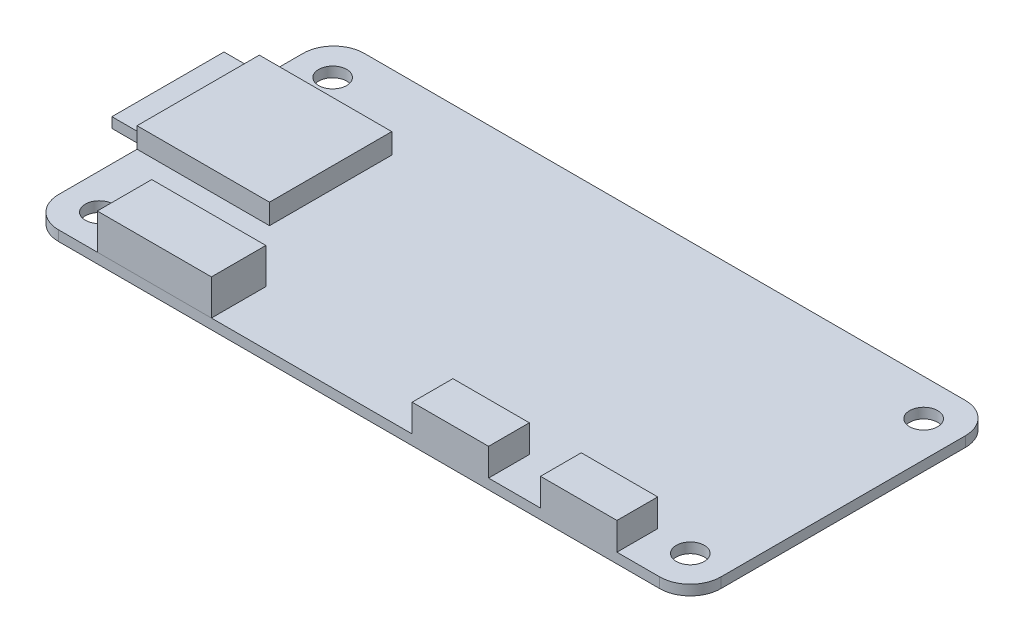
ISO-10303-21;
HEADER;
FILE_DESCRIPTION(('STEP AP214'),'2;1');
FILE_NAME('part.step','',(''),(''),'','','');
FILE_SCHEMA(('AUTOMOTIVE_DESIGN { 1 0 10303 214 1 1 1 1 }'));
ENDSEC;
DATA;
#1=APPLICATION_CONTEXT('core data for automotive mechanical design processes');
#2=APPLICATION_PROTOCOL_DEFINITION('international standard','automotive_design',2000,#1);
#3=PRODUCT_CONTEXT('',#1,'mechanical');
#4=PRODUCT('Part','Part','',(#3));
#5=PRODUCT_RELATED_PRODUCT_CATEGORY('part','',(#4));
#6=PRODUCT_DEFINITION_FORMATION('','',#4);
#7=PRODUCT_DEFINITION_CONTEXT('part definition',#1,'design');
#8=PRODUCT_DEFINITION('design','',#6,#7);
#9=PRODUCT_DEFINITION_SHAPE('','',#8);
#10=(LENGTH_UNIT() NAMED_UNIT(*) SI_UNIT(.MILLI.,.METRE.));
#11=(NAMED_UNIT(*) PLANE_ANGLE_UNIT() SI_UNIT($,.RADIAN.));
#12=(NAMED_UNIT(*) SI_UNIT($,.STERADIAN.) SOLID_ANGLE_UNIT());
#13=UNCERTAINTY_MEASURE_WITH_UNIT(LENGTH_MEASURE(1.E-05),#10,'distance_accuracy_value','');
#14=(GEOMETRIC_REPRESENTATION_CONTEXT(3) GLOBAL_UNCERTAINTY_ASSIGNED_CONTEXT((#13)) GLOBAL_UNIT_ASSIGNED_CONTEXT((#10,
#11,#12)) REPRESENTATION_CONTEXT('',''));
#15=CARTESIAN_POINT('',(0.,0.,0.));
#16=DIRECTION('',(0.,0.,1.));
#17=DIRECTION('',(1.,0.,0.));
#18=AXIS2_PLACEMENT_3D('',#15,#16,#17);
#19=CARTESIAN_POINT('',(-32.5,3.,-7.7));
#20=DIRECTION('',(1.,0.,0.));
#21=DIRECTION('',(0.,0.,-1.));
#22=AXIS2_PLACEMENT_3D('',#19,#20,#21);
#23=PLANE('',#22);
#24=DIRECTION('',(0.,-1.,0.));
#25=VECTOR('',#24,1.);
#26=CARTESIAN_POINT('',(-32.5,3.,-7.23286961546787));
#27=LINE('',#26,#25);
#28=CARTESIAN_POINT('',(-32.5,2.,-7.23286961546788));
#29=VERTEX_POINT('',#28);
#30=CARTESIAN_POINT('',(-32.5,1.,-7.23286961546788));
#31=VERTEX_POINT('',#30);
#32=EDGE_CURVE('E64',#29,#31,#27,.T.);
#33=ORIENTED_EDGE('',*,*,#32,.F.);
#34=DIRECTION('',(0.,0.,1.));
#35=VECTOR('',#34,1.);
#36=CARTESIAN_POINT('',(-32.5,2.,-7.7));
#37=LINE('',#36,#35);
#38=CARTESIAN_POINT('',(-32.5,2.,3.76713038453212));
#39=VERTEX_POINT('',#38);
#40=EDGE_CURVE('E59',#29,#39,#37,.T.);
#41=ORIENTED_EDGE('',*,*,#40,.T.);
#42=DIRECTION('',(0.,1.,0.));
#43=VECTOR('',#42,1.);
#44=CARTESIAN_POINT('',(-32.5,3.,3.76713038453212));
#45=LINE('',#44,#43);
#46=CARTESIAN_POINT('',(-32.5,1.,3.76713038453212));
#47=VERTEX_POINT('',#46);
#48=EDGE_CURVE('E124',#47,#39,#45,.T.);
#49=ORIENTED_EDGE('',*,*,#48,.F.);
#50=DIRECTION('',(0.,0.,1.));
#51=VECTOR('',#50,1.);
#52=CARTESIAN_POINT('',(-32.5,1.,-7.7));
#53=LINE('',#52,#51);
#54=CARTESIAN_POINT('',(-32.5,1.,4.29999999999999));
#55=VERTEX_POINT('',#54);
#56=EDGE_CURVE('E143',#47,#55,#53,.T.);
#57=ORIENTED_EDGE('',*,*,#56,.T.);
#58=DIRECTION('',(0.,-1.,0.));
#59=VECTOR('',#58,1.);
#60=CARTESIAN_POINT('',(-32.5,3.,4.29999999999999));
#61=LINE('',#60,#59);
#62=CARTESIAN_POINT('',(-32.5,3.,4.29999999999999));
#63=VERTEX_POINT('',#62);
#64=EDGE_CURVE('E12',#63,#55,#61,.T.);
#65=ORIENTED_EDGE('',*,*,#64,.F.);
#66=DIRECTION('',(0.,0.,1.));
#67=VECTOR('',#66,1.);
#68=CARTESIAN_POINT('',(-32.5,3.,-7.7));
#69=LINE('',#68,#67);
#70=CARTESIAN_POINT('',(-32.5,3.,-7.7));
#71=VERTEX_POINT('',#70);
#72=EDGE_CURVE('E144',#71,#63,#69,.T.);
#73=ORIENTED_EDGE('',*,*,#72,.F.);
#74=DIRECTION('',(0.,-1.,0.));
#75=VECTOR('',#74,1.);
#76=CARTESIAN_POINT('',(-32.5,3.,-7.7));
#77=LINE('',#76,#75);
#78=CARTESIAN_POINT('',(-32.5,1.,-7.7));
#79=VERTEX_POINT('',#78);
#80=EDGE_CURVE('E154',#71,#79,#77,.T.);
#81=ORIENTED_EDGE('',*,*,#80,.T.);
#82=EDGE_CURVE('E155',#79,#31,#53,.T.);
#83=ORIENTED_EDGE('',*,*,#82,.T.);
#84=EDGE_LOOP('',(#33,#41,#49,#57,#65,#73,#81,#83));
#85=FACE_BOUND('',#84,.T.);
#86=ADVANCED_FACE('F45',(#85),#23,.F.);
#87=CARTESIAN_POINT('',(-32.5,3.,4.29999999999999));
#88=DIRECTION('',(0.,0.,-1.));
#89=DIRECTION('',(-1.,0.,0.));
#90=AXIS2_PLACEMENT_3D('',#87,#88,#89);
#91=PLANE('',#90);
#92=DIRECTION('',(1.,0.,0.));
#93=VECTOR('',#92,1.);
#94=CARTESIAN_POINT('',(-32.5,1.,4.29999999999999));
#95=LINE('',#94,#93);
#96=CARTESIAN_POINT('',(-19.5,1.,4.3));
#97=VERTEX_POINT('',#96);
#98=EDGE_CURVE('E157',#55,#97,#95,.T.);
#99=ORIENTED_EDGE('',*,*,#98,.T.);
#100=DIRECTION('',(0.,-1.,0.));
#101=VECTOR('',#100,1.);
#102=CARTESIAN_POINT('',(-19.5,3.,4.3));
#103=LINE('',#102,#101);
#104=CARTESIAN_POINT('',(-19.5,3.,4.3));
#105=VERTEX_POINT('',#104);
#106=EDGE_CURVE('E52',#105,#97,#103,.T.);
#107=ORIENTED_EDGE('',*,*,#106,.F.);
#108=DIRECTION('',(1.,0.,0.));
#109=VECTOR('',#108,1.);
#110=CARTESIAN_POINT('',(-32.5,3.,4.29999999999999));
#111=LINE('',#110,#109);
#112=EDGE_CURVE('E147',#63,#105,#111,.T.);
#113=ORIENTED_EDGE('',*,*,#112,.F.);
#114=ORIENTED_EDGE('',*,*,#64,.T.);
#115=EDGE_LOOP('',(#99,#107,#113,#114));
#116=FACE_BOUND('',#115,.T.);
#117=ADVANCED_FACE('F187',(#116),#91,.F.);
#118=CARTESIAN_POINT('',(-19.5,3.,4.3));
#119=DIRECTION('',(-1.,0.,0.));
#120=DIRECTION('',(0.,0.,1.));
#121=AXIS2_PLACEMENT_3D('',#118,#119,#120);
#122=PLANE('',#121);
#123=DIRECTION('',(0.,0.,-1.));
#124=VECTOR('',#123,1.);
#125=CARTESIAN_POINT('',(-19.5,1.,4.3));
#126=LINE('',#125,#124);
#127=CARTESIAN_POINT('',(-19.5,1.,-7.7));
#128=VERTEX_POINT('',#127);
#129=EDGE_CURVE('E159',#97,#128,#126,.T.);
#130=ORIENTED_EDGE('',*,*,#129,.T.);
#131=DIRECTION('',(0.,-1.,0.));
#132=VECTOR('',#131,1.);
#133=CARTESIAN_POINT('',(-19.5,3.,-7.7));
#134=LINE('',#133,#132);
#135=CARTESIAN_POINT('',(-19.5,3.,-7.7));
#136=VERTEX_POINT('',#135);
#137=EDGE_CURVE('E164',#136,#128,#134,.T.);
#138=ORIENTED_EDGE('',*,*,#137,.F.);
#139=DIRECTION('',(0.,0.,-1.));
#140=VECTOR('',#139,1.);
#141=CARTESIAN_POINT('',(-19.5,3.,4.3));
#142=LINE('',#141,#140);
#143=EDGE_CURVE('E150',#105,#136,#142,.T.);
#144=ORIENTED_EDGE('',*,*,#143,.F.);
#145=ORIENTED_EDGE('',*,*,#106,.T.);
#146=EDGE_LOOP('',(#130,#138,#144,#145));
#147=FACE_BOUND('',#146,.T.);
#148=ADVANCED_FACE('F171',(#147),#122,.F.);
#149=CARTESIAN_POINT('',(-19.5,3.,-7.7));
#150=DIRECTION('',(0.,0.,1.));
#151=DIRECTION('',(1.,0.,0.));
#152=AXIS2_PLACEMENT_3D('',#149,#150,#151);
#153=PLANE('',#152);
#154=DIRECTION('',(-1.,0.,0.));
#155=VECTOR('',#154,1.);
#156=CARTESIAN_POINT('',(-19.5,1.,-7.7));
#157=LINE('',#156,#155);
#158=EDGE_CURVE('E148',#128,#79,#157,.T.);
#159=ORIENTED_EDGE('',*,*,#158,.T.);
#160=ORIENTED_EDGE('',*,*,#80,.F.);
#161=DIRECTION('',(-1.,0.,0.));
#162=VECTOR('',#161,1.);
#163=CARTESIAN_POINT('',(-19.5,3.,-7.7));
#164=LINE('',#163,#162);
#165=EDGE_CURVE('E152',#136,#71,#164,.T.);
#166=ORIENTED_EDGE('',*,*,#165,.F.);
#167=ORIENTED_EDGE('',*,*,#137,.T.);
#168=EDGE_LOOP('',(#159,#160,#166,#167));
#169=FACE_BOUND('',#168,.T.);
#170=ADVANCED_FACE('F181',(#169),#153,.F.);
#171=CARTESIAN_POINT('',(0.,3.,0.));
#172=DIRECTION('',(0.,1.,0.));
#173=DIRECTION('',(0.,0.,1.));
#174=AXIS2_PLACEMENT_3D('',#171,#172,#173);
#175=PLANE('',#174);
#176=ORIENTED_EDGE('',*,*,#72,.T.);
#177=ORIENTED_EDGE('',*,*,#112,.T.);
#178=ORIENTED_EDGE('',*,*,#143,.T.);
#179=ORIENTED_EDGE('',*,*,#165,.T.);
#180=EDGE_LOOP('',(#176,#177,#178,#179));
#181=FACE_BOUND('',#180,.T.);
#182=ADVANCED_FACE('F186',(#181),#175,.T.);
#183=CARTESIAN_POINT('',(0.,1.,0.));
#184=DIRECTION('',(0.,1.,0.));
#185=DIRECTION('',(0.,0.,1.));
#186=AXIS2_PLACEMENT_3D('',#183,#184,#185);
#187=PLANE('',#186);
#188=ORIENTED_EDGE('',*,*,#56,.F.);
#189=DIRECTION('',(1.,0.,0.));
#190=VECTOR('',#189,1.);
#191=CARTESIAN_POINT('',(-35.5,1.,3.76713038453212));
#192=LINE('',#191,#190);
#193=CARTESIAN_POINT('',(-35.5,1.,3.76713038453212));
#194=VERTEX_POINT('',#193);
#195=EDGE_CURVE('E115',#194,#47,#192,.T.);
#196=ORIENTED_EDGE('',*,*,#195,.F.);
#197=DIRECTION('',(0.,0.,1.));
#198=VECTOR('',#197,1.);
#199=CARTESIAN_POINT('',(-35.5,1.,-7.23286961546787));
#200=LINE('',#199,#198);
#201=CARTESIAN_POINT('',(-35.5,1.,-7.23286961546787));
#202=VERTEX_POINT('',#201);
#203=EDGE_CURVE('E135',#202,#194,#200,.T.);
#204=ORIENTED_EDGE('',*,*,#203,.F.);
#205=DIRECTION('',(-1.,0.,0.));
#206=VECTOR('',#205,1.);
#207=CARTESIAN_POINT('',(-19.5,1.,-7.23286961546788));
#208=LINE('',#207,#206);
#209=EDGE_CURVE('E121',#31,#202,#208,.T.);
#210=ORIENTED_EDGE('',*,*,#209,.F.);
#211=ORIENTED_EDGE('',*,*,#82,.F.);
#212=ORIENTED_EDGE('',*,*,#158,.F.);
#213=ORIENTED_EDGE('',*,*,#129,.F.);
#214=ORIENTED_EDGE('',*,*,#98,.F.);
#215=EDGE_LOOP('',(#188,#196,#204,#210,#211,#212,#213,#214));
#216=FACE_BOUND('',#215,.T.);
#217=ADVANCED_FACE('F177',(#216),#187,.F.);
#218=CARTESIAN_POINT('',(0.,2.,0.));
#219=DIRECTION('',(0.,1.,0.));
#220=DIRECTION('',(0.,0.,1.));
#221=AXIS2_PLACEMENT_3D('',#218,#219,#220);
#222=PLANE('',#221);
#223=ORIENTED_EDGE('',*,*,#40,.F.);
#224=DIRECTION('',(-1.,0.,0.));
#225=VECTOR('',#224,1.);
#226=CARTESIAN_POINT('',(-19.5,2.,-7.23286961546788));
#227=LINE('',#226,#225);
#228=CARTESIAN_POINT('',(-35.5,2.,-7.23286961546787));
#229=VERTEX_POINT('',#228);
#230=EDGE_CURVE('E107',#29,#229,#227,.T.);
#231=ORIENTED_EDGE('',*,*,#230,.T.);
#232=DIRECTION('',(0.,0.,1.));
#233=VECTOR('',#232,1.);
#234=CARTESIAN_POINT('',(-35.5,2.,-7.23286961546787));
#235=LINE('',#234,#233);
#236=CARTESIAN_POINT('',(-35.5,2.,3.76713038453212));
#237=VERTEX_POINT('',#236);
#238=EDGE_CURVE('E112',#229,#237,#235,.T.);
#239=ORIENTED_EDGE('',*,*,#238,.T.);
#240=DIRECTION('',(1.,0.,0.));
#241=VECTOR('',#240,1.);
#242=CARTESIAN_POINT('',(-35.5,2.,3.76713038453212));
#243=LINE('',#242,#241);
#244=EDGE_CURVE('E130',#237,#39,#243,.T.);
#245=ORIENTED_EDGE('',*,*,#244,.T.);
#246=EDGE_LOOP('',(#223,#231,#239,#245));
#247=FACE_BOUND('',#246,.T.);
#248=ADVANCED_FACE('F109',(#247),#222,.T.);
#249=CARTESIAN_POINT('',(-19.5,2.,-7.23286961546788));
#250=DIRECTION('',(0.,0.,1.));
#251=DIRECTION('',(1.,0.,0.));
#252=AXIS2_PLACEMENT_3D('',#249,#250,#251);
#253=PLANE('',#252);
#254=ORIENTED_EDGE('',*,*,#230,.F.);
#255=ORIENTED_EDGE('',*,*,#32,.T.);
#256=ORIENTED_EDGE('',*,*,#209,.T.);
#257=DIRECTION('',(0.,-1.,0.));
#258=VECTOR('',#257,1.);
#259=CARTESIAN_POINT('',(-35.5,2.,-7.23286961546787));
#260=LINE('',#259,#258);
#261=EDGE_CURVE('E118',#229,#202,#260,.T.);
#262=ORIENTED_EDGE('',*,*,#261,.F.);
#263=EDGE_LOOP('',(#254,#255,#256,#262));
#264=FACE_BOUND('',#263,.T.);
#265=ADVANCED_FACE('F119',(#264),#253,.F.);
#266=CARTESIAN_POINT('',(-35.5,2.,3.76713038453212));
#267=DIRECTION('',(0.,0.,-1.));
#268=DIRECTION('',(-1.,0.,0.));
#269=AXIS2_PLACEMENT_3D('',#266,#267,#268);
#270=PLANE('',#269);
#271=ORIENTED_EDGE('',*,*,#195,.T.);
#272=ORIENTED_EDGE('',*,*,#48,.T.);
#273=ORIENTED_EDGE('',*,*,#244,.F.);
#274=DIRECTION('',(0.,-1.,0.));
#275=VECTOR('',#274,1.);
#276=CARTESIAN_POINT('',(-35.5,2.,3.76713038453212));
#277=LINE('',#276,#275);
#278=EDGE_CURVE('E125',#237,#194,#277,.T.);
#279=ORIENTED_EDGE('',*,*,#278,.T.);
#280=EDGE_LOOP('',(#271,#272,#273,#279));
#281=FACE_BOUND('',#280,.T.);
#282=ADVANCED_FACE('F203',(#281),#270,.F.);
#283=CARTESIAN_POINT('',(-35.5,2.,-7.23286961546787));
#284=DIRECTION('',(1.,0.,0.));
#285=DIRECTION('',(0.,0.,-1.));
#286=AXIS2_PLACEMENT_3D('',#283,#284,#285);
#287=PLANE('',#286);
#288=ORIENTED_EDGE('',*,*,#203,.T.);
#289=ORIENTED_EDGE('',*,*,#278,.F.);
#290=ORIENTED_EDGE('',*,*,#238,.F.);
#291=ORIENTED_EDGE('',*,*,#261,.T.);
#292=EDGE_LOOP('',(#288,#289,#290,#291));
#293=FACE_BOUND('',#292,.T.);
#294=ADVANCED_FACE('F127',(#293),#287,.F.);
#295=CLOSED_SHELL('',(#86,#117,#148,#170,#182,#217,#248,#265,#282,#294));
#296=MANIFOLD_SOLID_BREP('B2',#295);
#297=CARTESIAN_POINT('',(-25.7,4.5,9.65690803511646));
#298=DIRECTION('',(1.,0.,0.));
#299=DIRECTION('',(0.,0.,-1.));
#300=AXIS2_PLACEMENT_3D('',#297,#298,#299);
#301=PLANE('',#300);
#302=DIRECTION('',(0.,0.,1.));
#303=VECTOR('',#302,1.);
#304=CARTESIAN_POINT('',(-25.7,1.,9.65690803511646));
#305=LINE('',#304,#303);
#306=CARTESIAN_POINT('',(-25.7,1.,9.65690803511646));
#307=VERTEX_POINT('',#306);
#308=CARTESIAN_POINT('',(-25.7,1.,15.));
#309=VERTEX_POINT('',#308);
#310=EDGE_CURVE('E346',#307,#309,#305,.T.);
#311=ORIENTED_EDGE('',*,*,#310,.T.);
#312=DIRECTION('',(0.,-1.,0.));
#313=VECTOR('',#312,1.);
#314=CARTESIAN_POINT('',(-25.7,4.5,15.));
#315=LINE('',#314,#313);
#316=CARTESIAN_POINT('',(-25.7,4.5,15.));
#317=VERTEX_POINT('',#316);
#318=EDGE_CURVE('E43',#317,#309,#315,.T.);
#319=ORIENTED_EDGE('',*,*,#318,.F.);
#320=DIRECTION('',(0.,0.,1.));
#321=VECTOR('',#320,1.);
#322=CARTESIAN_POINT('',(-25.7,4.5,9.65690803511646));
#323=LINE('',#322,#321);
#324=CARTESIAN_POINT('',(-25.7,4.5,9.65690803511646));
#325=VERTEX_POINT('',#324);
#326=EDGE_CURVE('E334',#325,#317,#323,.T.);
#327=ORIENTED_EDGE('',*,*,#326,.F.);
#328=DIRECTION('',(0.,-1.,0.));
#329=VECTOR('',#328,1.);
#330=CARTESIAN_POINT('',(-25.7,4.5,9.65690803511646));
#331=LINE('',#330,#329);
#332=EDGE_CURVE('E342',#325,#307,#331,.T.);
#333=ORIENTED_EDGE('',*,*,#332,.T.);
#334=EDGE_LOOP('',(#311,#319,#327,#333));
#335=FACE_BOUND('',#334,.T.);
#336=ADVANCED_FACE('F283',(#335),#301,.F.);
#337=CARTESIAN_POINT('',(-25.7,4.5,15.));
#338=DIRECTION('',(0.,0.,-1.));
#339=DIRECTION('',(-1.,0.,0.));
#340=AXIS2_PLACEMENT_3D('',#337,#338,#339);
#341=PLANE('',#340);
#342=DIRECTION('',(1.,0.,0.));
#343=VECTOR('',#342,1.);
#344=CARTESIAN_POINT('',(-25.7,1.,15.));
#345=LINE('',#344,#343);
#346=CARTESIAN_POINT('',(-14.5,1.,15.));
#347=VERTEX_POINT('',#346);
#348=EDGE_CURVE('E338',#309,#347,#345,.T.);
#349=ORIENTED_EDGE('',*,*,#348,.T.);
#350=DIRECTION('',(0.,-1.,0.));
#351=VECTOR('',#350,1.);
#352=CARTESIAN_POINT('',(-14.5,4.5,15.));
#353=LINE('',#352,#351);
#354=CARTESIAN_POINT('',(-14.5,4.5,15.));
#355=VERTEX_POINT('',#354);
#356=EDGE_CURVE('E291',#355,#347,#353,.T.);
#357=ORIENTED_EDGE('',*,*,#356,.F.);
#358=DIRECTION('',(1.,0.,0.));
#359=VECTOR('',#358,1.);
#360=CARTESIAN_POINT('',(-25.7,4.5,15.));
#361=LINE('',#360,#359);
#362=EDGE_CURVE('E329',#317,#355,#361,.T.);
#363=ORIENTED_EDGE('',*,*,#362,.F.);
#364=ORIENTED_EDGE('',*,*,#318,.T.);
#365=EDGE_LOOP('',(#349,#357,#363,#364));
#366=FACE_BOUND('',#365,.T.);
#367=ADVANCED_FACE('F337',(#366),#341,.F.);
#368=CARTESIAN_POINT('',(-14.5,4.5,15.));
#369=DIRECTION('',(-1.,0.,0.));
#370=DIRECTION('',(0.,0.,1.));
#371=AXIS2_PLACEMENT_3D('',#368,#369,#370);
#372=PLANE('',#371);
#373=DIRECTION('',(0.,0.,-1.));
#374=VECTOR('',#373,1.);
#375=CARTESIAN_POINT('',(-14.5,1.,15.));
#376=LINE('',#375,#374);
#377=CARTESIAN_POINT('',(-14.5,1.,9.65690803511646));
#378=VERTEX_POINT('',#377);
#379=EDGE_CURVE('E316',#347,#378,#376,.T.);
#380=ORIENTED_EDGE('',*,*,#379,.T.);
#381=DIRECTION('',(0.,-1.,0.));
#382=VECTOR('',#381,1.);
#383=CARTESIAN_POINT('',(-14.5,4.5,9.65690803511646));
#384=LINE('',#383,#382);
#385=CARTESIAN_POINT('',(-14.5,4.5,9.65690803511646));
#386=VERTEX_POINT('',#385);
#387=EDGE_CURVE('E339',#386,#378,#384,.T.);
#388=ORIENTED_EDGE('',*,*,#387,.F.);
#389=DIRECTION('',(0.,0.,-1.));
#390=VECTOR('',#389,1.);
#391=CARTESIAN_POINT('',(-14.5,4.5,15.));
#392=LINE('',#391,#390);
#393=EDGE_CURVE('E332',#355,#386,#392,.T.);
#394=ORIENTED_EDGE('',*,*,#393,.F.);
#395=ORIENTED_EDGE('',*,*,#356,.T.);
#396=EDGE_LOOP('',(#380,#388,#394,#395));
#397=FACE_BOUND('',#396,.T.);
#398=ADVANCED_FACE('F340',(#397),#372,.F.);
#399=CARTESIAN_POINT('',(-14.5,4.5,9.65690803511646));
#400=DIRECTION('',(0.,0.,1.));
#401=DIRECTION('',(1.,0.,0.));
#402=AXIS2_PLACEMENT_3D('',#399,#400,#401);
#403=PLANE('',#402);
#404=DIRECTION('',(-1.,0.,0.));
#405=VECTOR('',#404,1.);
#406=CARTESIAN_POINT('',(-14.5,1.,9.65690803511646));
#407=LINE('',#406,#405);
#408=EDGE_CURVE('E322',#378,#307,#407,.T.);
#409=ORIENTED_EDGE('',*,*,#408,.T.);
#410=ORIENTED_EDGE('',*,*,#332,.F.);
#411=DIRECTION('',(-1.,0.,0.));
#412=VECTOR('',#411,1.);
#413=CARTESIAN_POINT('',(-14.5,4.5,9.65690803511646));
#414=LINE('',#413,#412);
#415=EDGE_CURVE('E299',#386,#325,#414,.T.);
#416=ORIENTED_EDGE('',*,*,#415,.F.);
#417=ORIENTED_EDGE('',*,*,#387,.T.);
#418=EDGE_LOOP('',(#409,#410,#416,#417));
#419=FACE_BOUND('',#418,.T.);
#420=ADVANCED_FACE('F353',(#419),#403,.F.);
#421=CARTESIAN_POINT('',(0.,4.5,0.));
#422=DIRECTION('',(0.,1.,0.));
#423=DIRECTION('',(0.,0.,1.));
#424=AXIS2_PLACEMENT_3D('',#421,#422,#423);
#425=PLANE('',#424);
#426=ORIENTED_EDGE('',*,*,#326,.T.);
#427=ORIENTED_EDGE('',*,*,#362,.T.);
#428=ORIENTED_EDGE('',*,*,#393,.T.);
#429=ORIENTED_EDGE('',*,*,#415,.T.);
#430=EDGE_LOOP('',(#426,#427,#428,#429));
#431=FACE_BOUND('',#430,.T.);
#432=ADVANCED_FACE('F330',(#431),#425,.T.);
#433=CARTESIAN_POINT('',(0.,1.,0.));
#434=DIRECTION('',(0.,1.,0.));
#435=DIRECTION('',(0.,0.,1.));
#436=AXIS2_PLACEMENT_3D('',#433,#434,#435);
#437=PLANE('',#436);
#438=ORIENTED_EDGE('',*,*,#310,.F.);
#439=ORIENTED_EDGE('',*,*,#408,.F.);
#440=ORIENTED_EDGE('',*,*,#379,.F.);
#441=ORIENTED_EDGE('',*,*,#348,.F.);
#442=EDGE_LOOP('',(#438,#439,#440,#441));
#443=FACE_BOUND('',#442,.T.);
#444=ADVANCED_FACE('F356',(#443),#437,.F.);
#445=CLOSED_SHELL('',(#336,#367,#398,#420,#432,#444));
#446=MANIFOLD_SOLID_BREP('B6',#445);
#447=CARTESIAN_POINT('',(-29.5,1.,-12.));
#448=DIRECTION('',(0.,1.,0.));
#449=DIRECTION('',(0.,0.,1.));
#450=AXIS2_PLACEMENT_3D('',#447,#448,#449);
#451=PLANE('',#450);
#452=CARTESIAN_POINT('',(-29.,1.,11.5));
#453=DIRECTION('',(0.,1.,0.));
#454=DIRECTION('',(0.,0.,1.));
#455=AXIS2_PLACEMENT_3D('',#452,#453,#454);
#456=CIRCLE('',#455,1.375);
#457=CARTESIAN_POINT('',(-29.,1.,12.875));
#458=VERTEX_POINT('',#457);
#459=EDGE_CURVE('E582',#458,#458,#456,.T.);
#460=ORIENTED_EDGE('',*,*,#459,.F.);
#461=EDGE_LOOP('',(#460));
#462=FACE_BOUND('',#461,.T.);
#463=CARTESIAN_POINT('',(29.,1.,-11.4));
#464=DIRECTION('',(0.,1.,0.));
#465=DIRECTION('',(0.,0.,1.));
#466=AXIS2_PLACEMENT_3D('',#463,#464,#465);
#467=CIRCLE('',#466,1.375);
#468=CARTESIAN_POINT('',(29.,1.,-10.025));
#469=VERTEX_POINT('',#468);
#470=EDGE_CURVE('E594',#469,#469,#467,.T.);
#471=ORIENTED_EDGE('',*,*,#470,.F.);
#472=EDGE_LOOP('',(#471));
#473=FACE_BOUND('',#472,.T.);
#474=CARTESIAN_POINT('',(29.,1.,11.5));
#475=DIRECTION('',(0.,1.,0.));
#476=DIRECTION('',(0.,0.,1.));
#477=AXIS2_PLACEMENT_3D('',#474,#475,#476);
#478=CIRCLE('',#477,1.375);
#479=CARTESIAN_POINT('',(29.,1.,12.875));
#480=VERTEX_POINT('',#479);
#481=EDGE_CURVE('E588',#480,#480,#478,.T.);
#482=ORIENTED_EDGE('',*,*,#481,.F.);
#483=EDGE_LOOP('',(#482));
#484=FACE_BOUND('',#483,.T.);
#485=CARTESIAN_POINT('',(-29.,1.,-11.4));
#486=DIRECTION('',(0.,1.,0.));
#487=DIRECTION('',(0.,0.,1.));
#488=AXIS2_PLACEMENT_3D('',#485,#486,#487);
#489=CIRCLE('',#488,1.375);
#490=CARTESIAN_POINT('',(-29.,1.,-10.025));
#491=VERTEX_POINT('',#490);
#492=EDGE_CURVE('E576',#491,#491,#489,.T.);
#493=ORIENTED_EDGE('',*,*,#492,.F.);
#494=EDGE_LOOP('',(#493));
#495=FACE_BOUND('',#494,.T.);
#496=DIRECTION('',(1.,0.,0.));
#497=VECTOR('',#496,1.);
#498=CARTESIAN_POINT('',(-29.5,1.,15.));
#499=LINE('',#498,#497);
#500=CARTESIAN_POINT('',(-29.5,1.,15.));
#501=VERTEX_POINT('',#500);
#502=CARTESIAN_POINT('',(5.19999999999998,1.,15.));
#503=VERTEX_POINT('',#502);
#504=EDGE_CURVE('E609',#501,#503,#499,.T.);
#505=ORIENTED_EDGE('',*,*,#504,.T.);
#506=DIRECTION('',(0.,0.,1.));
#507=VECTOR('',#506,1.);
#508=CARTESIAN_POINT('',(5.19999999999998,1.,11.));
#509=LINE('',#508,#507);
#510=CARTESIAN_POINT('',(5.19999999999998,1.,11.));
#511=VERTEX_POINT('',#510);
#512=EDGE_CURVE('E426',#511,#503,#509,.T.);
#513=ORIENTED_EDGE('',*,*,#512,.F.);
#514=DIRECTION('',(-1.,0.,0.));
#515=VECTOR('',#514,1.);
#516=CARTESIAN_POINT('',(12.7,1.,11.));
#517=LINE('',#516,#515);
#518=CARTESIAN_POINT('',(12.7,1.,11.));
#519=VERTEX_POINT('',#518);
#520=EDGE_CURVE('E421',#519,#511,#517,.T.);
#521=ORIENTED_EDGE('',*,*,#520,.F.);
#522=DIRECTION('',(0.,0.,-1.));
#523=VECTOR('',#522,1.);
#524=CARTESIAN_POINT('',(12.7,1.,15.));
#525=LINE('',#524,#523);
#526=CARTESIAN_POINT('',(12.7,1.,15.));
#527=VERTEX_POINT('',#526);
#528=EDGE_CURVE('E676',#527,#519,#525,.T.);
#529=ORIENTED_EDGE('',*,*,#528,.F.);
#530=CARTESIAN_POINT('',(17.8,1.,15.));
#531=VERTEX_POINT('',#530);
#532=EDGE_CURVE('E612',#527,#531,#499,.T.);
#533=ORIENTED_EDGE('',*,*,#532,.T.);
#534=DIRECTION('',(0.,0.,1.));
#535=VECTOR('',#534,1.);
#536=CARTESIAN_POINT('',(17.8,1.,11.));
#537=LINE('',#536,#535);
#538=CARTESIAN_POINT('',(17.8,1.,11.));
#539=VERTEX_POINT('',#538);
#540=EDGE_CURVE('E540',#539,#531,#537,.T.);
#541=ORIENTED_EDGE('',*,*,#540,.F.);
#542=DIRECTION('',(-1.,0.,0.));
#543=VECTOR('',#542,1.);
#544=CARTESIAN_POINT('',(25.3,1.,11.));
#545=LINE('',#544,#543);
#546=CARTESIAN_POINT('',(25.3,1.,11.));
#547=VERTEX_POINT('',#546);
#548=EDGE_CURVE('E553',#547,#539,#545,.T.);
#549=ORIENTED_EDGE('',*,*,#548,.F.);
#550=DIRECTION('',(0.,0.,-1.));
#551=VECTOR('',#550,1.);
#552=CARTESIAN_POINT('',(25.3,1.,15.));
#553=LINE('',#552,#551);
#554=CARTESIAN_POINT('',(25.3,1.,15.));
#555=VERTEX_POINT('',#554);
#556=EDGE_CURVE('E543',#555,#547,#553,.T.);
#557=ORIENTED_EDGE('',*,*,#556,.F.);
#558=CARTESIAN_POINT('',(29.5,1.,15.));
#559=VERTEX_POINT('',#558);
#560=EDGE_CURVE('E608',#555,#559,#499,.T.);
#561=ORIENTED_EDGE('',*,*,#560,.T.);
#562=CARTESIAN_POINT('',(29.5,1.,12.));
#563=DIRECTION('',(0.,1.,0.));
#564=DIRECTION('',(0.,0.,1.));
#565=AXIS2_PLACEMENT_3D('',#562,#563,#564);
#566=CIRCLE('',#565,3.);
#567=CARTESIAN_POINT('',(32.5,1.,12.));
#568=VERTEX_POINT('',#567);
#569=EDGE_CURVE('E611',#559,#568,#566,.T.);
#570=ORIENTED_EDGE('',*,*,#569,.T.);
#571=DIRECTION('',(0.,0.,-1.));
#572=VECTOR('',#571,1.);
#573=CARTESIAN_POINT('',(32.5,1.,12.));
#574=LINE('',#573,#572);
#575=CARTESIAN_POINT('',(32.5,1.,-12.));
#576=VERTEX_POINT('',#575);
#577=EDGE_CURVE('E614',#568,#576,#574,.T.);
#578=ORIENTED_EDGE('',*,*,#577,.T.);
#579=CARTESIAN_POINT('',(29.5,1.,-12.));
#580=DIRECTION('',(0.,1.,0.));
#581=DIRECTION('',(0.,0.,1.));
#582=AXIS2_PLACEMENT_3D('',#579,#580,#581);
#583=CIRCLE('',#582,3.);
#584=CARTESIAN_POINT('',(29.5,1.,-15.));
#585=VERTEX_POINT('',#584);
#586=EDGE_CURVE('E616',#576,#585,#583,.T.);
#587=ORIENTED_EDGE('',*,*,#586,.T.);
#588=DIRECTION('',(-1.,0.,0.));
#589=VECTOR('',#588,1.);
#590=CARTESIAN_POINT('',(29.5,1.,-15.));
#591=LINE('',#590,#589);
#592=CARTESIAN_POINT('',(-29.5,1.,-15.));
#593=VERTEX_POINT('',#592);
#594=EDGE_CURVE('E618',#585,#593,#591,.T.);
#595=ORIENTED_EDGE('',*,*,#594,.T.);
#596=CARTESIAN_POINT('',(-29.5,1.,-12.));
#597=DIRECTION('',(0.,1.,0.));
#598=DIRECTION('',(0.,0.,1.));
#599=AXIS2_PLACEMENT_3D('',#596,#597,#598);
#600=CIRCLE('',#599,3.);
#601=CARTESIAN_POINT('',(-32.5,1.,-12.));
#602=VERTEX_POINT('',#601);
#603=EDGE_CURVE('E600',#593,#602,#600,.T.);
#604=ORIENTED_EDGE('',*,*,#603,.T.);
#605=DIRECTION('',(0.,0.,1.));
#606=VECTOR('',#605,1.);
#607=CARTESIAN_POINT('',(-32.5,1.,-12.));
#608=LINE('',#607,#606);
#609=CARTESIAN_POINT('',(-32.5,1.,12.));
#610=VERTEX_POINT('',#609);
#611=EDGE_CURVE('E603',#602,#610,#608,.T.);
#612=ORIENTED_EDGE('',*,*,#611,.T.);
#613=CARTESIAN_POINT('',(-29.5,1.,12.));
#614=DIRECTION('',(0.,1.,0.));
#615=DIRECTION('',(0.,0.,1.));
#616=AXIS2_PLACEMENT_3D('',#613,#614,#615);
#617=CIRCLE('',#616,3.);
#618=EDGE_CURVE('E606',#610,#501,#617,.T.);
#619=ORIENTED_EDGE('',*,*,#618,.T.);
#620=EDGE_LOOP('',(#505,#513,#521,#529,#533,#541,#549,#557,#561,#570,#578,#587,#595,#604,#612,#619));
#621=FACE_BOUND('',#620,.T.);
#622=ADVANCED_FACE('F406',(#462,#473,#484,#495,#621),#451,.T.);
#623=CARTESIAN_POINT('',(-29.5,0.,-12.));
#624=DIRECTION('',(0.,1.,0.));
#625=DIRECTION('',(0.,0.,1.));
#626=AXIS2_PLACEMENT_3D('',#623,#624,#625);
#627=PLANE('',#626);
#628=CARTESIAN_POINT('',(-29.5,0.,-12.));
#629=DIRECTION('',(0.,1.,0.));
#630=DIRECTION('',(0.,0.,1.));
#631=AXIS2_PLACEMENT_3D('',#628,#629,#630);
#632=CIRCLE('',#631,3.);
#633=CARTESIAN_POINT('',(-29.5,0.,-15.));
#634=VERTEX_POINT('',#633);
#635=CARTESIAN_POINT('',(-32.5,0.,-12.));
#636=VERTEX_POINT('',#635);
#637=EDGE_CURVE('E597',#634,#636,#632,.T.);
#638=ORIENTED_EDGE('',*,*,#637,.F.);
#639=DIRECTION('',(-1.,0.,0.));
#640=VECTOR('',#639,1.);
#641=CARTESIAN_POINT('',(29.5,0.,-15.));
#642=LINE('',#641,#640);
#643=CARTESIAN_POINT('',(29.5,0.,-15.));
#644=VERTEX_POINT('',#643);
#645=EDGE_CURVE('E604',#644,#634,#642,.T.);
#646=ORIENTED_EDGE('',*,*,#645,.F.);
#647=CARTESIAN_POINT('',(29.5,0.,-12.));
#648=DIRECTION('',(0.,1.,0.));
#649=DIRECTION('',(0.,0.,1.));
#650=AXIS2_PLACEMENT_3D('',#647,#648,#649);
#651=CIRCLE('',#650,3.);
#652=CARTESIAN_POINT('',(32.5,0.,-12.));
#653=VERTEX_POINT('',#652);
#654=EDGE_CURVE('E633',#653,#644,#651,.T.);
#655=ORIENTED_EDGE('',*,*,#654,.F.);
#656=DIRECTION('',(0.,0.,-1.));
#657=VECTOR('',#656,1.);
#658=CARTESIAN_POINT('',(32.5,0.,12.));
#659=LINE('',#658,#657);
#660=CARTESIAN_POINT('',(32.5,0.,12.));
#661=VERTEX_POINT('',#660);
#662=EDGE_CURVE('E631',#661,#653,#659,.T.);
#663=ORIENTED_EDGE('',*,*,#662,.F.);
#664=CARTESIAN_POINT('',(29.5,0.,12.));
#665=DIRECTION('',(0.,1.,0.));
#666=DIRECTION('',(0.,0.,1.));
#667=AXIS2_PLACEMENT_3D('',#664,#665,#666);
#668=CIRCLE('',#667,3.);
#669=CARTESIAN_POINT('',(29.5,0.,15.));
#670=VERTEX_POINT('',#669);
#671=EDGE_CURVE('E629',#670,#661,#668,.T.);
#672=ORIENTED_EDGE('',*,*,#671,.F.);
#673=DIRECTION('',(1.,0.,0.));
#674=VECTOR('',#673,1.);
#675=CARTESIAN_POINT('',(-29.5,0.,15.));
#676=LINE('',#675,#674);
#677=CARTESIAN_POINT('',(-29.5,0.,15.));
#678=VERTEX_POINT('',#677);
#679=EDGE_CURVE('E627',#678,#670,#676,.T.);
#680=ORIENTED_EDGE('',*,*,#679,.F.);
#681=CARTESIAN_POINT('',(-29.5,0.,12.));
#682=DIRECTION('',(0.,1.,0.));
#683=DIRECTION('',(0.,0.,1.));
#684=AXIS2_PLACEMENT_3D('',#681,#682,#683);
#685=CIRCLE('',#684,3.);
#686=CARTESIAN_POINT('',(-32.5,0.,12.));
#687=VERTEX_POINT('',#686);
#688=EDGE_CURVE('E625',#687,#678,#685,.T.);
#689=ORIENTED_EDGE('',*,*,#688,.F.);
#690=DIRECTION('',(0.,0.,1.));
#691=VECTOR('',#690,1.);
#692=CARTESIAN_POINT('',(-32.5,0.,-12.));
#693=LINE('',#692,#691);
#694=EDGE_CURVE('E623',#636,#687,#693,.T.);
#695=ORIENTED_EDGE('',*,*,#694,.F.);
#696=EDGE_LOOP('',(#638,#646,#655,#663,#672,#680,#689,#695));
#697=FACE_BOUND('',#696,.T.);
#698=CARTESIAN_POINT('',(29.,0.,-11.4));
#699=DIRECTION('',(0.,1.,0.));
#700=DIRECTION('',(0.,0.,1.));
#701=AXIS2_PLACEMENT_3D('',#698,#699,#700);
#702=CIRCLE('',#701,1.375);
#703=CARTESIAN_POINT('',(29.,0.,-10.025));
#704=VERTEX_POINT('',#703);
#705=EDGE_CURVE('E591',#704,#704,#702,.T.);
#706=ORIENTED_EDGE('',*,*,#705,.T.);
#707=EDGE_LOOP('',(#706));
#708=FACE_BOUND('',#707,.T.);
#709=CARTESIAN_POINT('',(29.,0.,11.5));
#710=DIRECTION('',(0.,1.,0.));
#711=DIRECTION('',(0.,0.,1.));
#712=AXIS2_PLACEMENT_3D('',#709,#710,#711);
#713=CIRCLE('',#712,1.375);
#714=CARTESIAN_POINT('',(29.,0.,12.875));
#715=VERTEX_POINT('',#714);
#716=EDGE_CURVE('E585',#715,#715,#713,.T.);
#717=ORIENTED_EDGE('',*,*,#716,.T.);
#718=EDGE_LOOP('',(#717));
#719=FACE_BOUND('',#718,.T.);
#720=CARTESIAN_POINT('',(-29.,0.,11.5));
#721=DIRECTION('',(0.,1.,0.));
#722=DIRECTION('',(0.,0.,1.));
#723=AXIS2_PLACEMENT_3D('',#720,#721,#722);
#724=CIRCLE('',#723,1.375);
#725=CARTESIAN_POINT('',(-29.,0.,12.875));
#726=VERTEX_POINT('',#725);
#727=EDGE_CURVE('E579',#726,#726,#724,.T.);
#728=ORIENTED_EDGE('',*,*,#727,.T.);
#729=EDGE_LOOP('',(#728));
#730=FACE_BOUND('',#729,.T.);
#731=CARTESIAN_POINT('',(-29.,0.,-11.4));
#732=DIRECTION('',(0.,1.,0.));
#733=DIRECTION('',(0.,0.,1.));
#734=AXIS2_PLACEMENT_3D('',#731,#732,#733);
#735=CIRCLE('',#734,1.375);
#736=CARTESIAN_POINT('',(-29.,0.,-10.025));
#737=VERTEX_POINT('',#736);
#738=EDGE_CURVE('E575',#737,#737,#735,.T.);
#739=ORIENTED_EDGE('',*,*,#738,.T.);
#740=EDGE_LOOP('',(#739));
#741=FACE_BOUND('',#740,.T.);
#742=ADVANCED_FACE('F663',(#697,#708,#719,#730,#741),#627,.F.);
#743=CARTESIAN_POINT('',(-29.5,1.,-12.));
#744=DIRECTION('',(0.,-1.,0.));
#745=DIRECTION('',(0.,0.,-1.));
#746=AXIS2_PLACEMENT_3D('',#743,#744,#745);
#747=CYLINDRICAL_SURFACE('',#746,3.);
#748=ORIENTED_EDGE('',*,*,#637,.T.);
#749=DIRECTION('',(0.,-1.,0.));
#750=VECTOR('',#749,1.);
#751=CARTESIAN_POINT('',(-32.5,1.,-12.));
#752=LINE('',#751,#750);
#753=EDGE_CURVE('E281',#602,#636,#752,.T.);
#754=ORIENTED_EDGE('',*,*,#753,.F.);
#755=ORIENTED_EDGE('',*,*,#603,.F.);
#756=DIRECTION('',(0.,-1.,0.));
#757=VECTOR('',#756,1.);
#758=CARTESIAN_POINT('',(-29.5,1.,-15.));
#759=LINE('',#758,#757);
#760=EDGE_CURVE('E620',#593,#634,#759,.T.);
#761=ORIENTED_EDGE('',*,*,#760,.T.);
#762=EDGE_LOOP('',(#748,#754,#755,#761));
#763=FACE_BOUND('',#762,.T.);
#764=ADVANCED_FACE('F408',(#763),#747,.T.);
#765=CARTESIAN_POINT('',(-32.5,1.,-12.));
#766=DIRECTION('',(1.,0.,0.));
#767=DIRECTION('',(0.,0.,-1.));
#768=AXIS2_PLACEMENT_3D('',#765,#766,#767);
#769=PLANE('',#768);
#770=ORIENTED_EDGE('',*,*,#694,.T.);
#771=DIRECTION('',(0.,-1.,0.));
#772=VECTOR('',#771,1.);
#773=CARTESIAN_POINT('',(-32.5,1.,12.));
#774=LINE('',#773,#772);
#775=EDGE_CURVE('E414',#610,#687,#774,.T.);
#776=ORIENTED_EDGE('',*,*,#775,.F.);
#777=ORIENTED_EDGE('',*,*,#611,.F.);
#778=ORIENTED_EDGE('',*,*,#753,.T.);
#779=EDGE_LOOP('',(#770,#776,#777,#778));
#780=FACE_BOUND('',#779,.T.);
#781=ADVANCED_FACE('F730',(#780),#769,.F.);
#782=CARTESIAN_POINT('',(-29.5,1.,12.));
#783=DIRECTION('',(0.,-1.,0.));
#784=DIRECTION('',(0.,0.,-1.));
#785=AXIS2_PLACEMENT_3D('',#782,#783,#784);
#786=CYLINDRICAL_SURFACE('',#785,3.);
#787=ORIENTED_EDGE('',*,*,#688,.T.);
#788=DIRECTION('',(0.,-1.,0.));
#789=VECTOR('',#788,1.);
#790=CARTESIAN_POINT('',(-29.5,1.,15.));
#791=LINE('',#790,#789);
#792=EDGE_CURVE('E650',#501,#678,#791,.T.);
#793=ORIENTED_EDGE('',*,*,#792,.F.);
#794=ORIENTED_EDGE('',*,*,#618,.F.);
#795=ORIENTED_EDGE('',*,*,#775,.T.);
#796=EDGE_LOOP('',(#787,#793,#794,#795));
#797=FACE_BOUND('',#796,.T.);
#798=ADVANCED_FACE('F657',(#797),#786,.T.);
#799=CARTESIAN_POINT('',(-29.5,1.,15.));
#800=DIRECTION('',(0.,0.,-1.));
#801=DIRECTION('',(-1.,0.,0.));
#802=AXIS2_PLACEMENT_3D('',#799,#800,#801);
#803=PLANE('',#802);
#804=ORIENTED_EDGE('',*,*,#679,.T.);
#805=DIRECTION('',(0.,-1.,0.));
#806=VECTOR('',#805,1.);
#807=CARTESIAN_POINT('',(29.5,1.,15.));
#808=LINE('',#807,#806);
#809=EDGE_CURVE('E647',#559,#670,#808,.T.);
#810=ORIENTED_EDGE('',*,*,#809,.F.);
#811=ORIENTED_EDGE('',*,*,#560,.F.);
#812=DIRECTION('',(0.,-1.,0.));
#813=VECTOR('',#812,1.);
#814=CARTESIAN_POINT('',(25.3,3.7,15.));
#815=LINE('',#814,#813);
#816=CARTESIAN_POINT('',(25.3,3.7,15.));
#817=VERTEX_POINT('',#816);
#818=EDGE_CURVE('E569',#817,#555,#815,.T.);
#819=ORIENTED_EDGE('',*,*,#818,.F.);
#820=DIRECTION('',(1.,0.,0.));
#821=VECTOR('',#820,1.);
#822=CARTESIAN_POINT('',(17.8,3.7,15.));
#823=LINE('',#822,#821);
#824=CARTESIAN_POINT('',(17.8,3.7,15.));
#825=VERTEX_POINT('',#824);
#826=EDGE_CURVE('E552',#825,#817,#823,.T.);
#827=ORIENTED_EDGE('',*,*,#826,.F.);
#828=DIRECTION('',(0.,-1.,0.));
#829=VECTOR('',#828,1.);
#830=CARTESIAN_POINT('',(17.8,3.7,15.));
#831=LINE('',#830,#829);
#832=EDGE_CURVE('E572',#825,#531,#831,.T.);
#833=ORIENTED_EDGE('',*,*,#832,.T.);
#834=ORIENTED_EDGE('',*,*,#532,.F.);
#835=DIRECTION('',(0.,-1.,0.));
#836=VECTOR('',#835,1.);
#837=CARTESIAN_POINT('',(12.7,3.7,15.));
#838=LINE('',#837,#836);
#839=CARTESIAN_POINT('',(12.7,3.7,15.));
#840=VERTEX_POINT('',#839);
#841=EDGE_CURVE('E525',#840,#527,#838,.T.);
#842=ORIENTED_EDGE('',*,*,#841,.F.);
#843=DIRECTION('',(1.,0.,0.));
#844=VECTOR('',#843,1.);
#845=CARTESIAN_POINT('',(5.19999999999998,3.7,15.));
#846=LINE('',#845,#844);
#847=CARTESIAN_POINT('',(5.19999999999998,3.7,15.));
#848=VERTEX_POINT('',#847);
#849=EDGE_CURVE('E518',#848,#840,#846,.T.);
#850=ORIENTED_EDGE('',*,*,#849,.F.);
#851=DIRECTION('',(0.,-1.,0.));
#852=VECTOR('',#851,1.);
#853=CARTESIAN_POINT('',(5.19999999999998,3.7,15.));
#854=LINE('',#853,#852);
#855=EDGE_CURVE('E523',#848,#503,#854,.T.);
#856=ORIENTED_EDGE('',*,*,#855,.T.);
#857=ORIENTED_EDGE('',*,*,#504,.F.);
#858=ORIENTED_EDGE('',*,*,#792,.T.);
#859=EDGE_LOOP('',(#804,#810,#811,#819,#827,#833,#834,#842,#850,#856,#857,#858));
#860=FACE_BOUND('',#859,.T.);
#861=ADVANCED_FACE('F520',(#860),#803,.F.);
#862=CARTESIAN_POINT('',(29.5,1.,12.));
#863=DIRECTION('',(0.,-1.,0.));
#864=DIRECTION('',(0.,0.,-1.));
#865=AXIS2_PLACEMENT_3D('',#862,#863,#864);
#866=CYLINDRICAL_SURFACE('',#865,3.);
#867=ORIENTED_EDGE('',*,*,#671,.T.);
#868=DIRECTION('',(0.,-1.,0.));
#869=VECTOR('',#868,1.);
#870=CARTESIAN_POINT('',(32.5,1.,12.));
#871=LINE('',#870,#869);
#872=EDGE_CURVE('E644',#568,#661,#871,.T.);
#873=ORIENTED_EDGE('',*,*,#872,.F.);
#874=ORIENTED_EDGE('',*,*,#569,.F.);
#875=ORIENTED_EDGE('',*,*,#809,.T.);
#876=EDGE_LOOP('',(#867,#873,#874,#875));
#877=FACE_BOUND('',#876,.T.);
#878=ADVANCED_FACE('F671',(#877),#866,.T.);
#879=CARTESIAN_POINT('',(32.5,1.,12.));
#880=DIRECTION('',(-1.,0.,0.));
#881=DIRECTION('',(0.,0.,1.));
#882=AXIS2_PLACEMENT_3D('',#879,#880,#881);
#883=PLANE('',#882);
#884=ORIENTED_EDGE('',*,*,#662,.T.);
#885=DIRECTION('',(0.,-1.,0.));
#886=VECTOR('',#885,1.);
#887=CARTESIAN_POINT('',(32.5,1.,-12.));
#888=LINE('',#887,#886);
#889=EDGE_CURVE('E641',#576,#653,#888,.T.);
#890=ORIENTED_EDGE('',*,*,#889,.F.);
#891=ORIENTED_EDGE('',*,*,#577,.F.);
#892=ORIENTED_EDGE('',*,*,#872,.T.);
#893=EDGE_LOOP('',(#884,#890,#891,#892));
#894=FACE_BOUND('',#893,.T.);
#895=ADVANCED_FACE('F720',(#894),#883,.F.);
#896=CARTESIAN_POINT('',(29.5,1.,-12.));
#897=DIRECTION('',(0.,-1.,0.));
#898=DIRECTION('',(0.,0.,-1.));
#899=AXIS2_PLACEMENT_3D('',#896,#897,#898);
#900=CYLINDRICAL_SURFACE('',#899,3.);
#901=ORIENTED_EDGE('',*,*,#654,.T.);
#902=DIRECTION('',(0.,-1.,0.));
#903=VECTOR('',#902,1.);
#904=CARTESIAN_POINT('',(29.5,1.,-15.));
#905=LINE('',#904,#903);
#906=EDGE_CURVE('E638',#585,#644,#905,.T.);
#907=ORIENTED_EDGE('',*,*,#906,.F.);
#908=ORIENTED_EDGE('',*,*,#586,.F.);
#909=ORIENTED_EDGE('',*,*,#889,.T.);
#910=EDGE_LOOP('',(#901,#907,#908,#909));
#911=FACE_BOUND('',#910,.T.);
#912=ADVANCED_FACE('F716',(#911),#900,.T.);
#913=CARTESIAN_POINT('',(29.5,1.,-15.));
#914=DIRECTION('',(0.,0.,1.));
#915=DIRECTION('',(1.,0.,0.));
#916=AXIS2_PLACEMENT_3D('',#913,#914,#915);
#917=PLANE('',#916);
#918=ORIENTED_EDGE('',*,*,#645,.T.);
#919=ORIENTED_EDGE('',*,*,#760,.F.);
#920=ORIENTED_EDGE('',*,*,#594,.F.);
#921=ORIENTED_EDGE('',*,*,#906,.T.);
#922=EDGE_LOOP('',(#918,#919,#920,#921));
#923=FACE_BOUND('',#922,.T.);
#924=ADVANCED_FACE('F713',(#923),#917,.F.);
#925=CARTESIAN_POINT('',(29.,1.,-11.4));
#926=DIRECTION('',(0.,-1.,0.));
#927=DIRECTION('',(0.,0.,-1.));
#928=AXIS2_PLACEMENT_3D('',#925,#926,#927);
#929=CYLINDRICAL_SURFACE('',#928,1.375);
#930=ORIENTED_EDGE('',*,*,#470,.T.);
#931=EDGE_LOOP('',(#930));
#932=FACE_BOUND('',#931,.T.);
#933=ORIENTED_EDGE('',*,*,#705,.F.);
#934=EDGE_LOOP('',(#933));
#935=FACE_BOUND('',#934,.T.);
#936=ADVANCED_FACE('F710',(#932,#935),#929,.F.);
#937=CARTESIAN_POINT('',(29.,1.,11.5));
#938=DIRECTION('',(0.,-1.,0.));
#939=DIRECTION('',(0.,0.,-1.));
#940=AXIS2_PLACEMENT_3D('',#937,#938,#939);
#941=CYLINDRICAL_SURFACE('',#940,1.375);
#942=ORIENTED_EDGE('',*,*,#481,.T.);
#943=EDGE_LOOP('',(#942));
#944=FACE_BOUND('',#943,.T.);
#945=ORIENTED_EDGE('',*,*,#716,.F.);
#946=EDGE_LOOP('',(#945));
#947=FACE_BOUND('',#946,.T.);
#948=ADVANCED_FACE('F799',(#944,#947),#941,.F.);
#949=CARTESIAN_POINT('',(-29.,1.,11.5));
#950=DIRECTION('',(0.,-1.,0.));
#951=DIRECTION('',(0.,0.,-1.));
#952=AXIS2_PLACEMENT_3D('',#949,#950,#951);
#953=CYLINDRICAL_SURFACE('',#952,1.375);
#954=ORIENTED_EDGE('',*,*,#459,.T.);
#955=EDGE_LOOP('',(#954));
#956=FACE_BOUND('',#955,.T.);
#957=ORIENTED_EDGE('',*,*,#727,.F.);
#958=EDGE_LOOP('',(#957));
#959=FACE_BOUND('',#958,.T.);
#960=ADVANCED_FACE('F807',(#956,#959),#953,.F.);
#961=CARTESIAN_POINT('',(-29.,1.,-11.4));
#962=DIRECTION('',(0.,-1.,0.));
#963=DIRECTION('',(0.,0.,-1.));
#964=AXIS2_PLACEMENT_3D('',#961,#962,#963);
#965=CYLINDRICAL_SURFACE('',#964,1.375);
#966=ORIENTED_EDGE('',*,*,#492,.T.);
#967=EDGE_LOOP('',(#966));
#968=FACE_BOUND('',#967,.T.);
#969=ORIENTED_EDGE('',*,*,#738,.F.);
#970=EDGE_LOOP('',(#969));
#971=FACE_BOUND('',#970,.T.);
#972=ADVANCED_FACE('F815',(#968,#971),#965,.F.);
#973=CARTESIAN_POINT('',(17.8,3.7,11.));
#974=DIRECTION('',(1.,0.,0.));
#975=DIRECTION('',(0.,0.,-1.));
#976=AXIS2_PLACEMENT_3D('',#973,#974,#975);
#977=PLANE('',#976);
#978=ORIENTED_EDGE('',*,*,#540,.T.);
#979=ORIENTED_EDGE('',*,*,#832,.F.);
#980=DIRECTION('',(0.,0.,1.));
#981=VECTOR('',#980,1.);
#982=CARTESIAN_POINT('',(17.8,3.7,11.));
#983=LINE('',#982,#981);
#984=CARTESIAN_POINT('',(17.8,3.7,11.));
#985=VERTEX_POINT('',#984);
#986=EDGE_CURVE('E549',#985,#825,#983,.T.);
#987=ORIENTED_EDGE('',*,*,#986,.F.);
#988=DIRECTION('',(0.,-1.,0.));
#989=VECTOR('',#988,1.);
#990=CARTESIAN_POINT('',(17.8,3.7,11.));
#991=LINE('',#990,#989);
#992=EDGE_CURVE('E558',#985,#539,#991,.T.);
#993=ORIENTED_EDGE('',*,*,#992,.T.);
#994=EDGE_LOOP('',(#978,#979,#987,#993));
#995=FACE_BOUND('',#994,.T.);
#996=ADVANCED_FACE('F680',(#995),#977,.F.);
#997=CARTESIAN_POINT('',(25.3,3.7,15.));
#998=DIRECTION('',(-1.,0.,0.));
#999=DIRECTION('',(0.,0.,1.));
#1000=AXIS2_PLACEMENT_3D('',#997,#998,#999);
#1001=PLANE('',#1000);
#1002=ORIENTED_EDGE('',*,*,#556,.T.);
#1003=DIRECTION('',(0.,-1.,0.));
#1004=VECTOR('',#1003,1.);
#1005=CARTESIAN_POINT('',(25.3,3.7,11.));
#1006=LINE('',#1005,#1004);
#1007=CARTESIAN_POINT('',(25.3,3.7,11.));
#1008=VERTEX_POINT('',#1007);
#1009=EDGE_CURVE('E566',#1008,#547,#1006,.T.);
#1010=ORIENTED_EDGE('',*,*,#1009,.F.);
#1011=DIRECTION('',(0.,0.,-1.));
#1012=VECTOR('',#1011,1.);
#1013=CARTESIAN_POINT('',(25.3,3.7,15.));
#1014=LINE('',#1013,#1012);
#1015=EDGE_CURVE('E555',#817,#1008,#1014,.T.);
#1016=ORIENTED_EDGE('',*,*,#1015,.F.);
#1017=ORIENTED_EDGE('',*,*,#818,.T.);
#1018=EDGE_LOOP('',(#1002,#1010,#1016,#1017));
#1019=FACE_BOUND('',#1018,.T.);
#1020=ADVANCED_FACE('F687',(#1019),#1001,.F.);
#1021=CARTESIAN_POINT('',(25.3,3.7,11.));
#1022=DIRECTION('',(0.,0.,1.));
#1023=DIRECTION('',(1.,0.,0.));
#1024=AXIS2_PLACEMENT_3D('',#1021,#1022,#1023);
#1025=PLANE('',#1024);
#1026=ORIENTED_EDGE('',*,*,#548,.T.);
#1027=ORIENTED_EDGE('',*,*,#992,.F.);
#1028=DIRECTION('',(-1.,0.,0.));
#1029=VECTOR('',#1028,1.);
#1030=CARTESIAN_POINT('',(25.3,3.7,11.));
#1031=LINE('',#1030,#1029);
#1032=EDGE_CURVE('E557',#1008,#985,#1031,.T.);
#1033=ORIENTED_EDGE('',*,*,#1032,.F.);
#1034=ORIENTED_EDGE('',*,*,#1009,.T.);
#1035=EDGE_LOOP('',(#1026,#1027,#1033,#1034));
#1036=FACE_BOUND('',#1035,.T.);
#1037=ADVANCED_FACE('F684',(#1036),#1025,.F.);
#1038=CARTESIAN_POINT('',(0.,3.7,0.));
#1039=DIRECTION('',(0.,1.,0.));
#1040=DIRECTION('',(0.,0.,1.));
#1041=AXIS2_PLACEMENT_3D('',#1038,#1039,#1040);
#1042=PLANE('',#1041);
#1043=ORIENTED_EDGE('',*,*,#986,.T.);
#1044=ORIENTED_EDGE('',*,*,#826,.T.);
#1045=ORIENTED_EDGE('',*,*,#1015,.T.);
#1046=ORIENTED_EDGE('',*,*,#1032,.T.);
#1047=EDGE_LOOP('',(#1043,#1044,#1045,#1046));
#1048=FACE_BOUND('',#1047,.T.);
#1049=ADVANCED_FACE('F690',(#1048),#1042,.T.);
#1050=CARTESIAN_POINT('',(5.19999999999998,3.7,11.));
#1051=DIRECTION('',(1.,0.,0.));
#1052=DIRECTION('',(0.,0.,-1.));
#1053=AXIS2_PLACEMENT_3D('',#1050,#1051,#1052);
#1054=PLANE('',#1053);
#1055=ORIENTED_EDGE('',*,*,#512,.T.);
#1056=ORIENTED_EDGE('',*,*,#855,.F.);
#1057=DIRECTION('',(0.,0.,1.));
#1058=VECTOR('',#1057,1.);
#1059=CARTESIAN_POINT('',(5.19999999999998,3.7,11.));
#1060=LINE('',#1059,#1058);
#1061=CARTESIAN_POINT('',(5.19999999999998,3.7,11.));
#1062=VERTEX_POINT('',#1061);
#1063=EDGE_CURVE('E529',#1062,#848,#1060,.T.);
#1064=ORIENTED_EDGE('',*,*,#1063,.F.);
#1065=DIRECTION('',(0.,-1.,0.));
#1066=VECTOR('',#1065,1.);
#1067=CARTESIAN_POINT('',(5.19999999999998,3.7,11.));
#1068=LINE('',#1067,#1066);
#1069=EDGE_CURVE('E894',#1062,#511,#1068,.T.);
#1070=ORIENTED_EDGE('',*,*,#1069,.T.);
#1071=EDGE_LOOP('',(#1055,#1056,#1064,#1070));
#1072=FACE_BOUND('',#1071,.T.);
#1073=ADVANCED_FACE('F539',(#1072),#1054,.F.);
#1074=CARTESIAN_POINT('',(12.7,3.7,15.));
#1075=DIRECTION('',(-1.,0.,0.));
#1076=DIRECTION('',(0.,0.,1.));
#1077=AXIS2_PLACEMENT_3D('',#1074,#1075,#1076);
#1078=PLANE('',#1077);
#1079=ORIENTED_EDGE('',*,*,#528,.T.);
#1080=DIRECTION('',(0.,-1.,0.));
#1081=VECTOR('',#1080,1.);
#1082=CARTESIAN_POINT('',(12.7,3.7,11.));
#1083=LINE('',#1082,#1081);
#1084=CARTESIAN_POINT('',(12.7,3.7,11.));
#1085=VERTEX_POINT('',#1084);
#1086=EDGE_CURVE('E545',#1085,#519,#1083,.T.);
#1087=ORIENTED_EDGE('',*,*,#1086,.F.);
#1088=DIRECTION('',(0.,0.,-1.));
#1089=VECTOR('',#1088,1.);
#1090=CARTESIAN_POINT('',(12.7,3.7,15.));
#1091=LINE('',#1090,#1089);
#1092=EDGE_CURVE('E528',#840,#1085,#1091,.T.);
#1093=ORIENTED_EDGE('',*,*,#1092,.F.);
#1094=ORIENTED_EDGE('',*,*,#841,.T.);
#1095=EDGE_LOOP('',(#1079,#1087,#1093,#1094));
#1096=FACE_BOUND('',#1095,.T.);
#1097=ADVANCED_FACE('F697',(#1096),#1078,.F.);
#1098=CARTESIAN_POINT('',(12.7,3.7,11.));
#1099=DIRECTION('',(0.,0.,1.));
#1100=DIRECTION('',(1.,0.,0.));
#1101=AXIS2_PLACEMENT_3D('',#1098,#1099,#1100);
#1102=PLANE('',#1101);
#1103=ORIENTED_EDGE('',*,*,#520,.T.);
#1104=ORIENTED_EDGE('',*,*,#1069,.F.);
#1105=DIRECTION('',(-1.,0.,0.));
#1106=VECTOR('',#1105,1.);
#1107=CARTESIAN_POINT('',(12.7,3.7,11.));
#1108=LINE('',#1107,#1106);
#1109=EDGE_CURVE('E534',#1085,#1062,#1108,.T.);
#1110=ORIENTED_EDGE('',*,*,#1109,.F.);
#1111=ORIENTED_EDGE('',*,*,#1086,.T.);
#1112=EDGE_LOOP('',(#1103,#1104,#1110,#1111));
#1113=FACE_BOUND('',#1112,.T.);
#1114=ADVANCED_FACE('F871',(#1113),#1102,.F.);
#1115=CARTESIAN_POINT('',(0.,3.7,0.));
#1116=DIRECTION('',(0.,1.,0.));
#1117=DIRECTION('',(0.,0.,1.));
#1118=AXIS2_PLACEMENT_3D('',#1115,#1116,#1117);
#1119=PLANE('',#1118);
#1120=ORIENTED_EDGE('',*,*,#1063,.T.);
#1121=ORIENTED_EDGE('',*,*,#849,.T.);
#1122=ORIENTED_EDGE('',*,*,#1092,.T.);
#1123=ORIENTED_EDGE('',*,*,#1109,.T.);
#1124=EDGE_LOOP('',(#1120,#1121,#1122,#1123));
#1125=FACE_BOUND('',#1124,.T.);
#1126=ADVANCED_FACE('F532',(#1125),#1119,.T.);
#1127=CLOSED_SHELL('',(#622,#742,#764,#781,#798,#861,#878,#895,#912,#924,#936,#948,#960,#972,
#996,#1020,#1037,#1049,#1073,#1097,#1114,#1126));
#1128=MANIFOLD_SOLID_BREP('B37',#1127);
#1129=ADVANCED_BREP_SHAPE_REPRESENTATION('',(#18,#296,#446,#1128),#14);
#1130=SHAPE_DEFINITION_REPRESENTATION(#9,#1129);
ENDSEC;
END-ISO-10303-21;
